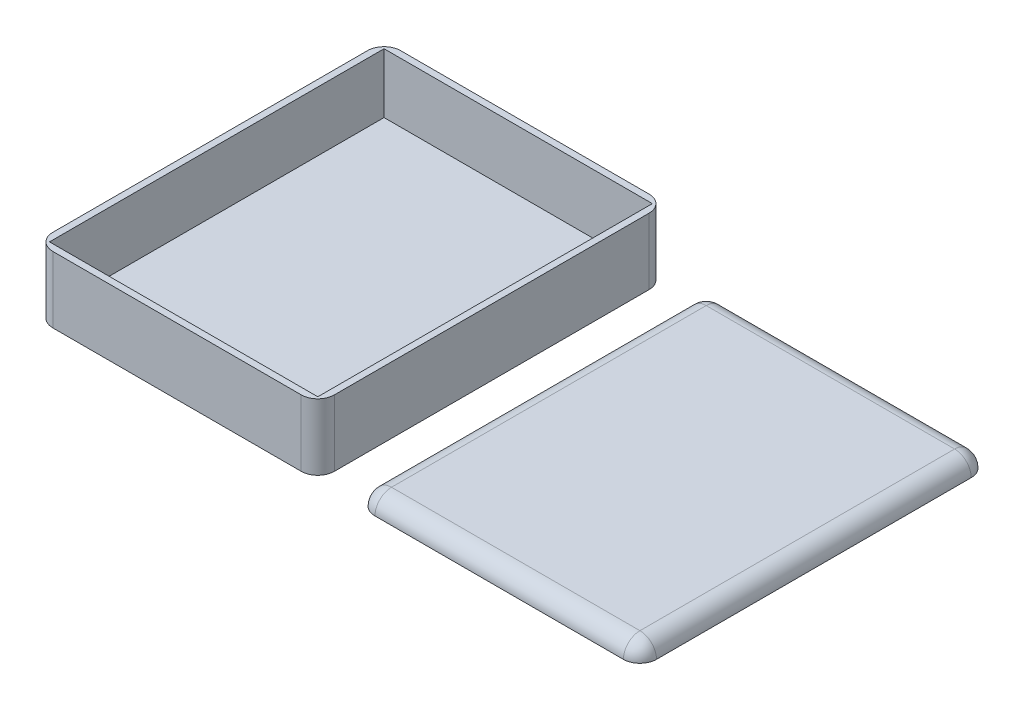
ISO-10303-21;
HEADER;
FILE_DESCRIPTION(('STEP AP214'),'2;1');
FILE_NAME('part.step','',(''),(''),'','','');
FILE_SCHEMA(('AUTOMOTIVE_DESIGN { 1 0 10303 214 1 1 1 1 }'));
ENDSEC;
DATA;
#1=APPLICATION_CONTEXT('core data for automotive mechanical design processes');
#2=APPLICATION_PROTOCOL_DEFINITION('international standard','automotive_design',2000,#1);
#3=PRODUCT_CONTEXT('',#1,'mechanical');
#4=PRODUCT('Part','Part','',(#3));
#5=PRODUCT_RELATED_PRODUCT_CATEGORY('part','',(#4));
#6=PRODUCT_DEFINITION_FORMATION('','',#4);
#7=PRODUCT_DEFINITION_CONTEXT('part definition',#1,'design');
#8=PRODUCT_DEFINITION('design','',#6,#7);
#9=PRODUCT_DEFINITION_SHAPE('','',#8);
#10=(LENGTH_UNIT() NAMED_UNIT(*) SI_UNIT(.MILLI.,.METRE.));
#11=(NAMED_UNIT(*) PLANE_ANGLE_UNIT() SI_UNIT($,.RADIAN.));
#12=(NAMED_UNIT(*) SI_UNIT($,.STERADIAN.) SOLID_ANGLE_UNIT());
#13=UNCERTAINTY_MEASURE_WITH_UNIT(LENGTH_MEASURE(1.E-05),#10,'distance_accuracy_value','');
#14=(GEOMETRIC_REPRESENTATION_CONTEXT(3) GLOBAL_UNCERTAINTY_ASSIGNED_CONTEXT((#13)) GLOBAL_UNIT_ASSIGNED_CONTEXT((#10,
#11,#12)) REPRESENTATION_CONTEXT('',''));
#15=CARTESIAN_POINT('',(0.,0.,0.));
#16=DIRECTION('',(0.,0.,1.));
#17=DIRECTION('',(1.,0.,0.));
#18=AXIS2_PLACEMENT_3D('',#15,#16,#17);
#19=CARTESIAN_POINT('',(0.,5.,0.));
#20=DIRECTION('',(0.,1.,0.));
#21=DIRECTION('',(0.,0.,1.));
#22=AXIS2_PLACEMENT_3D('',#19,#20,#21);
#23=PLANE('',#22);
#24=DIRECTION('',(-1.,0.,0.));
#25=VECTOR('',#24,1.);
#26=CARTESIAN_POINT('',(60.2801641953968,5.,-46.9702641608001));
#27=LINE('',#26,#25);
#28=CARTESIAN_POINT('',(135.280164195397,5.,-46.9702641608001));
#29=VERTEX_POINT('',#28);
#30=CARTESIAN_POINT('',(60.2801641953968,5.,-46.9702641608001));
#31=VERTEX_POINT('',#30);
#32=EDGE_CURVE('E61',#29,#31,#27,.T.);
#33=ORIENTED_EDGE('',*,*,#32,.T.);
#34=DIRECTION('',(0.,0.,1.));
#35=VECTOR('',#34,1.);
#36=CARTESIAN_POINT('',(60.2801641953968,5.,48.0297358391999));
#37=LINE('',#36,#35);
#38=CARTESIAN_POINT('',(60.2801641953968,5.,48.0297358391999));
#39=VERTEX_POINT('',#38);
#40=EDGE_CURVE('E12',#31,#39,#37,.T.);
#41=ORIENTED_EDGE('',*,*,#40,.T.);
#42=DIRECTION('',(1.,0.,0.));
#43=VECTOR('',#42,1.);
#44=CARTESIAN_POINT('',(135.280164195397,5.,48.0297358391999));
#45=LINE('',#44,#43);
#46=CARTESIAN_POINT('',(135.280164195397,5.,48.0297358391999));
#47=VERTEX_POINT('',#46);
#48=EDGE_CURVE('E126',#39,#47,#45,.T.);
#49=ORIENTED_EDGE('',*,*,#48,.T.);
#50=DIRECTION('',(0.,0.,-1.));
#51=VECTOR('',#50,1.);
#52=CARTESIAN_POINT('',(135.280164195397,5.,-46.9702641608001));
#53=LINE('',#52,#51);
#54=EDGE_CURVE('E72',#47,#29,#53,.T.);
#55=ORIENTED_EDGE('',*,*,#54,.T.);
#56=EDGE_LOOP('',(#33,#41,#49,#55));
#57=FACE_BOUND('',#56,.T.);
#58=ADVANCED_FACE('F51',(#57),#23,.T.);
#59=CARTESIAN_POINT('',(0.,0.,0.));
#60=DIRECTION('',(0.,1.,0.));
#61=DIRECTION('',(0.,0.,1.));
#62=AXIS2_PLACEMENT_3D('',#59,#60,#61);
#63=PLANE('',#62);
#64=DIRECTION('',(0.,0.,1.));
#65=VECTOR('',#64,1.);
#66=CARTESIAN_POINT('',(55.2801641953968,0.,-51.9702641608001));
#67=LINE('',#66,#65);
#68=CARTESIAN_POINT('',(55.2801641953968,0.,-46.9702641608001));
#69=VERTEX_POINT('',#68);
#70=CARTESIAN_POINT('',(55.2801641953968,0.,48.0297358391999));
#71=VERTEX_POINT('',#70);
#72=EDGE_CURVE('E105',#69,#71,#67,.T.);
#73=ORIENTED_EDGE('',*,*,#72,.F.);
#74=CARTESIAN_POINT('',(60.2801641953968,0.,-46.9702641608001));
#75=DIRECTION('',(0.,1.,0.));
#76=DIRECTION('',(0.,0.,1.));
#77=AXIS2_PLACEMENT_3D('',#74,#75,#76);
#78=CIRCLE('',#77,5.);
#79=CARTESIAN_POINT('',(60.2801641953968,0.,-51.9702641608001));
#80=VERTEX_POINT('',#79);
#81=EDGE_CURVE('E108',#69,#80,#78,.F.);
#82=ORIENTED_EDGE('',*,*,#81,.T.);
#83=DIRECTION('',(-1.,0.,0.));
#84=VECTOR('',#83,1.);
#85=CARTESIAN_POINT('',(55.2801641953968,0.,-51.9702641608001));
#86=LINE('',#85,#84);
#87=CARTESIAN_POINT('',(135.280164195397,0.,-51.9702641608001));
#88=VERTEX_POINT('',#87);
#89=EDGE_CURVE('E154',#88,#80,#86,.T.);
#90=ORIENTED_EDGE('',*,*,#89,.F.);
#91=CARTESIAN_POINT('',(135.280164195397,0.,-46.9702641608001));
#92=DIRECTION('',(0.,1.,0.));
#93=DIRECTION('',(0.,0.,1.));
#94=AXIS2_PLACEMENT_3D('',#91,#92,#93);
#95=CIRCLE('',#94,5.);
#96=CARTESIAN_POINT('',(140.280164195397,0.,-46.9702641608001));
#97=VERTEX_POINT('',#96);
#98=EDGE_CURVE('E127',#88,#97,#95,.F.);
#99=ORIENTED_EDGE('',*,*,#98,.T.);
#100=DIRECTION('',(0.,0.,-1.));
#101=VECTOR('',#100,1.);
#102=CARTESIAN_POINT('',(140.280164195397,0.,-51.9702641608001));
#103=LINE('',#102,#101);
#104=CARTESIAN_POINT('',(140.280164195397,0.,48.0297358391999));
#105=VERTEX_POINT('',#104);
#106=EDGE_CURVE('E272',#105,#97,#103,.T.);
#107=ORIENTED_EDGE('',*,*,#106,.F.);
#108=CARTESIAN_POINT('',(135.280164195397,0.,48.0297358391999));
#109=DIRECTION('',(0.,1.,0.));
#110=DIRECTION('',(0.,0.,1.));
#111=AXIS2_PLACEMENT_3D('',#108,#109,#110);
#112=CIRCLE('',#111,5.);
#113=CARTESIAN_POINT('',(135.280164195397,0.,53.0297358391999));
#114=VERTEX_POINT('',#113);
#115=EDGE_CURVE('E158',#105,#114,#112,.F.);
#116=ORIENTED_EDGE('',*,*,#115,.T.);
#117=DIRECTION('',(1.,0.,0.));
#118=VECTOR('',#117,1.);
#119=CARTESIAN_POINT('',(55.2801641953968,0.,53.0297358391999));
#120=LINE('',#119,#118);
#121=CARTESIAN_POINT('',(60.2801641953968,0.,53.0297358391999));
#122=VERTEX_POINT('',#121);
#123=EDGE_CURVE('E116',#122,#114,#120,.T.);
#124=ORIENTED_EDGE('',*,*,#123,.F.);
#125=CARTESIAN_POINT('',(60.2801641953968,0.,48.0297358391999));
#126=DIRECTION('',(0.,1.,0.));
#127=DIRECTION('',(0.,0.,1.));
#128=AXIS2_PLACEMENT_3D('',#125,#126,#127);
#129=CIRCLE('',#128,5.);
#130=EDGE_CURVE('E111',#122,#71,#129,.F.);
#131=ORIENTED_EDGE('',*,*,#130,.T.);
#132=EDGE_LOOP('',(#73,#82,#90,#99,#107,#116,#124,#131));
#133=FACE_BOUND('',#132,.T.);
#134=ADVANCED_FACE('F107',(#133),#63,.F.);
#135=CARTESIAN_POINT('',(135.280164195397,0.,-46.9702641608001));
#136=DIRECTION('',(0.,1.,0.));
#137=DIRECTION('',(0.,0.,1.));
#138=AXIS2_PLACEMENT_3D('',#135,#136,#137);
#139=SPHERICAL_SURFACE('',#138,5.);
#140=CARTESIAN_POINT('',(135.280164195397,0.,-46.9702641608001));
#141=DIRECTION('',(0.,0.,1.));
#142=DIRECTION('',(1.,0.,0.));
#143=AXIS2_PLACEMENT_3D('',#140,#141,#142);
#144=CIRCLE('',#143,5.);
#145=EDGE_CURVE('E144',#97,#29,#144,.T.);
#146=ORIENTED_EDGE('',*,*,#145,.F.);
#147=ORIENTED_EDGE('',*,*,#98,.F.);
#148=CARTESIAN_POINT('',(135.280164195397,0.,-46.9702641608001));
#149=DIRECTION('',(-1.,0.,0.));
#150=DIRECTION('',(0.,0.,1.));
#151=AXIS2_PLACEMENT_3D('',#148,#149,#150);
#152=CIRCLE('',#151,5.);
#153=EDGE_CURVE('E55',#29,#88,#152,.T.);
#154=ORIENTED_EDGE('',*,*,#153,.F.);
#155=EDGE_LOOP('',(#146,#147,#154));
#156=FACE_BOUND('',#155,.T.);
#157=ADVANCED_FACE('F53',(#156),#139,.T.);
#158=CARTESIAN_POINT('',(0.,0.,-46.9702641608001));
#159=DIRECTION('',(1.,0.,0.));
#160=DIRECTION('',(0.,0.,-1.));
#161=AXIS2_PLACEMENT_3D('',#158,#159,#160);
#162=CYLINDRICAL_SURFACE('',#161,5.);
#163=ORIENTED_EDGE('',*,*,#153,.T.);
#164=ORIENTED_EDGE('',*,*,#89,.T.);
#165=CARTESIAN_POINT('',(60.2801641953968,0.,-46.9702641608001));
#166=DIRECTION('',(-1.,0.,0.));
#167=DIRECTION('',(0.,0.,1.));
#168=AXIS2_PLACEMENT_3D('',#165,#166,#167);
#169=CIRCLE('',#168,5.);
#170=EDGE_CURVE('E124',#31,#80,#169,.T.);
#171=ORIENTED_EDGE('',*,*,#170,.F.);
#172=ORIENTED_EDGE('',*,*,#32,.F.);
#173=EDGE_LOOP('',(#163,#164,#171,#172));
#174=FACE_BOUND('',#173,.T.);
#175=ADVANCED_FACE('F153',(#174),#162,.T.);
#176=CARTESIAN_POINT('',(135.280164195397,0.,0.));
#177=DIRECTION('',(0.,0.,1.));
#178=DIRECTION('',(1.,0.,0.));
#179=AXIS2_PLACEMENT_3D('',#176,#177,#178);
#180=CYLINDRICAL_SURFACE('',#179,5.);
#181=ORIENTED_EDGE('',*,*,#145,.T.);
#182=ORIENTED_EDGE('',*,*,#54,.F.);
#183=CARTESIAN_POINT('',(135.280164195397,0.,48.0297358391999));
#184=DIRECTION('',(0.,0.,1.));
#185=DIRECTION('',(1.,0.,0.));
#186=AXIS2_PLACEMENT_3D('',#183,#184,#185);
#187=CIRCLE('',#186,5.);
#188=EDGE_CURVE('E131',#105,#47,#187,.T.);
#189=ORIENTED_EDGE('',*,*,#188,.F.);
#190=ORIENTED_EDGE('',*,*,#106,.T.);
#191=EDGE_LOOP('',(#181,#182,#189,#190));
#192=FACE_BOUND('',#191,.T.);
#193=ADVANCED_FACE('F200',(#192),#180,.T.);
#194=CARTESIAN_POINT('',(60.2801641953968,0.,-46.9702641608001));
#195=DIRECTION('',(0.,1.,0.));
#196=DIRECTION('',(0.,0.,1.));
#197=AXIS2_PLACEMENT_3D('',#194,#195,#196);
#198=SPHERICAL_SURFACE('',#197,5.);
#199=ORIENTED_EDGE('',*,*,#170,.T.);
#200=ORIENTED_EDGE('',*,*,#81,.F.);
#201=CARTESIAN_POINT('',(60.2801641953968,0.,-46.9702641608001));
#202=DIRECTION('',(0.,0.,1.));
#203=DIRECTION('',(1.,0.,0.));
#204=AXIS2_PLACEMENT_3D('',#201,#202,#203);
#205=CIRCLE('',#204,5.);
#206=EDGE_CURVE('E122',#31,#69,#205,.T.);
#207=ORIENTED_EDGE('',*,*,#206,.F.);
#208=EDGE_LOOP('',(#199,#200,#207));
#209=FACE_BOUND('',#208,.T.);
#210=ADVANCED_FACE('F121',(#209),#198,.T.);
#211=CARTESIAN_POINT('',(135.280164195397,0.,48.0297358391999));
#212=DIRECTION('',(0.,1.,0.));
#213=DIRECTION('',(0.,0.,1.));
#214=AXIS2_PLACEMENT_3D('',#211,#212,#213);
#215=SPHERICAL_SURFACE('',#214,5.);
#216=ORIENTED_EDGE('',*,*,#115,.F.);
#217=ORIENTED_EDGE('',*,*,#188,.T.);
#218=CARTESIAN_POINT('',(135.280164195397,0.,48.0297358391999));
#219=DIRECTION('',(-1.,0.,0.));
#220=DIRECTION('',(0.,0.,1.));
#221=AXIS2_PLACEMENT_3D('',#218,#219,#220);
#222=CIRCLE('',#221,5.);
#223=EDGE_CURVE('E132',#114,#47,#222,.T.);
#224=ORIENTED_EDGE('',*,*,#223,.F.);
#225=EDGE_LOOP('',(#216,#217,#224));
#226=FACE_BOUND('',#225,.T.);
#227=ADVANCED_FACE('F194',(#226),#215,.T.);
#228=CARTESIAN_POINT('',(60.2801641953968,0.,0.));
#229=DIRECTION('',(0.,0.,-1.));
#230=DIRECTION('',(-1.,0.,0.));
#231=AXIS2_PLACEMENT_3D('',#228,#229,#230);
#232=CYLINDRICAL_SURFACE('',#231,5.);
#233=ORIENTED_EDGE('',*,*,#206,.T.);
#234=ORIENTED_EDGE('',*,*,#72,.T.);
#235=CARTESIAN_POINT('',(60.2801641953968,0.,48.0297358391999));
#236=DIRECTION('',(0.,0.,1.));
#237=DIRECTION('',(1.,0.,0.));
#238=AXIS2_PLACEMENT_3D('',#235,#236,#237);
#239=CIRCLE('',#238,5.);
#240=EDGE_CURVE('E139',#39,#71,#239,.T.);
#241=ORIENTED_EDGE('',*,*,#240,.F.);
#242=ORIENTED_EDGE('',*,*,#40,.F.);
#243=EDGE_LOOP('',(#233,#234,#241,#242));
#244=FACE_BOUND('',#243,.T.);
#245=ADVANCED_FACE('F129',(#244),#232,.T.);
#246=CARTESIAN_POINT('',(0.,0.,48.0297358391999));
#247=DIRECTION('',(-1.,0.,0.));
#248=DIRECTION('',(0.,0.,1.));
#249=AXIS2_PLACEMENT_3D('',#246,#247,#248);
#250=CYLINDRICAL_SURFACE('',#249,5.);
#251=ORIENTED_EDGE('',*,*,#223,.T.);
#252=ORIENTED_EDGE('',*,*,#48,.F.);
#253=CARTESIAN_POINT('',(60.2801641953968,0.,48.0297358391999));
#254=DIRECTION('',(-1.,0.,0.));
#255=DIRECTION('',(0.,0.,1.));
#256=AXIS2_PLACEMENT_3D('',#253,#254,#255);
#257=CIRCLE('',#256,5.);
#258=EDGE_CURVE('E170',#122,#39,#257,.T.);
#259=ORIENTED_EDGE('',*,*,#258,.F.);
#260=ORIENTED_EDGE('',*,*,#123,.T.);
#261=EDGE_LOOP('',(#251,#252,#259,#260));
#262=FACE_BOUND('',#261,.T.);
#263=ADVANCED_FACE('F178',(#262),#250,.T.);
#264=CARTESIAN_POINT('',(60.2801641953968,0.,48.0297358391999));
#265=DIRECTION('',(0.,1.,0.));
#266=DIRECTION('',(0.,0.,1.));
#267=AXIS2_PLACEMENT_3D('',#264,#265,#266);
#268=SPHERICAL_SURFACE('',#267,5.);
#269=ORIENTED_EDGE('',*,*,#240,.T.);
#270=ORIENTED_EDGE('',*,*,#130,.F.);
#271=ORIENTED_EDGE('',*,*,#258,.T.);
#272=EDGE_LOOP('',(#269,#270,#271));
#273=FACE_BOUND('',#272,.T.);
#274=ADVANCED_FACE('F174',(#273),#268,.T.);
#275=CLOSED_SHELL('',(#58,#134,#157,#175,#193,#210,#227,#245,#263,#274));
#276=MANIFOLD_SOLID_BREP('B2',#275);
#277=CARTESIAN_POINT('',(0.,20.,0.));
#278=DIRECTION('',(0.,-1.,0.));
#279=DIRECTION('',(0.,0.,-1.));
#280=AXIS2_PLACEMENT_3D('',#277,#278,#279);
#281=PLANE('',#280);
#282=DIRECTION('',(-1.,0.,0.));
#283=VECTOR('',#282,1.);
#284=CARTESIAN_POINT('',(-42.5,20.,-52.5));
#285=LINE('',#284,#283);
#286=CARTESIAN_POINT('',(37.5,20.,-52.5));
#287=VERTEX_POINT('',#286);
#288=CARTESIAN_POINT('',(-37.5,20.,-52.5));
#289=VERTEX_POINT('',#288);
#290=EDGE_CURVE('E412',#287,#289,#285,.T.);
#291=ORIENTED_EDGE('',*,*,#290,.T.);
#292=CARTESIAN_POINT('',(-37.5,20.,-47.5));
#293=DIRECTION('',(0.,-1.,0.));
#294=DIRECTION('',(0.,0.,-1.));
#295=AXIS2_PLACEMENT_3D('',#292,#293,#294);
#296=CIRCLE('',#295,5.);
#297=CARTESIAN_POINT('',(-42.5,20.,-47.5));
#298=VERTEX_POINT('',#297);
#299=EDGE_CURVE('E453',#289,#298,#296,.F.);
#300=ORIENTED_EDGE('',*,*,#299,.T.);
#301=DIRECTION('',(0.,0.,1.));
#302=VECTOR('',#301,1.);
#303=CARTESIAN_POINT('',(-42.5,20.,52.5));
#304=LINE('',#303,#302);
#305=CARTESIAN_POINT('',(-42.5,20.,47.5));
#306=VERTEX_POINT('',#305);
#307=EDGE_CURVE('E416',#298,#306,#304,.T.);
#308=ORIENTED_EDGE('',*,*,#307,.T.);
#309=CARTESIAN_POINT('',(-37.5,20.,47.5));
#310=DIRECTION('',(0.,-1.,0.));
#311=DIRECTION('',(0.,0.,-1.));
#312=AXIS2_PLACEMENT_3D('',#309,#310,#311);
#313=CIRCLE('',#312,5.);
#314=CARTESIAN_POINT('',(-37.5,20.,52.5));
#315=VERTEX_POINT('',#314);
#316=EDGE_CURVE('E303',#306,#315,#313,.F.);
#317=ORIENTED_EDGE('',*,*,#316,.T.);
#318=DIRECTION('',(1.,0.,0.));
#319=VECTOR('',#318,1.);
#320=CARTESIAN_POINT('',(-42.5,20.,52.5));
#321=LINE('',#320,#319);
#322=CARTESIAN_POINT('',(37.5,20.,52.5));
#323=VERTEX_POINT('',#322);
#324=EDGE_CURVE('E418',#315,#323,#321,.T.);
#325=ORIENTED_EDGE('',*,*,#324,.T.);
#326=CARTESIAN_POINT('',(37.5,20.,47.5));
#327=DIRECTION('',(0.,-1.,0.));
#328=DIRECTION('',(0.,0.,-1.));
#329=AXIS2_PLACEMENT_3D('',#326,#327,#328);
#330=CIRCLE('',#329,5.);
#331=CARTESIAN_POINT('',(42.5,20.,47.5));
#332=VERTEX_POINT('',#331);
#333=EDGE_CURVE('E449',#323,#332,#330,.F.);
#334=ORIENTED_EDGE('',*,*,#333,.T.);
#335=DIRECTION('',(0.,0.,-1.));
#336=VECTOR('',#335,1.);
#337=CARTESIAN_POINT('',(42.5,20.,52.5));
#338=LINE('',#337,#336);
#339=CARTESIAN_POINT('',(42.5,20.,-47.5));
#340=VERTEX_POINT('',#339);
#341=EDGE_CURVE('E409',#332,#340,#338,.T.);
#342=ORIENTED_EDGE('',*,*,#341,.T.);
#343=CARTESIAN_POINT('',(37.5,20.,-47.5));
#344=DIRECTION('',(0.,-1.,0.));
#345=DIRECTION('',(0.,0.,-1.));
#346=AXIS2_PLACEMENT_3D('',#343,#344,#345);
#347=CIRCLE('',#346,5.);
#348=EDGE_CURVE('E451',#340,#287,#347,.F.);
#349=ORIENTED_EDGE('',*,*,#348,.T.);
#350=EDGE_LOOP('',(#291,#300,#308,#317,#325,#334,#342,#349));
#351=FACE_BOUND('',#350,.T.);
#352=DIRECTION('',(0.,0.,-1.));
#353=VECTOR('',#352,1.);
#354=CARTESIAN_POINT('',(40.5,20.,0.));
#355=LINE('',#354,#353);
#356=CARTESIAN_POINT('',(40.5,20.,50.5));
#357=VERTEX_POINT('',#356);
#358=CARTESIAN_POINT('',(40.5,20.,-50.5));
#359=VERTEX_POINT('',#358);
#360=EDGE_CURVE('E398',#357,#359,#355,.T.);
#361=ORIENTED_EDGE('',*,*,#360,.F.);
#362=DIRECTION('',(1.,0.,0.));
#363=VECTOR('',#362,1.);
#364=CARTESIAN_POINT('',(0.,20.,50.5));
#365=LINE('',#364,#363);
#366=CARTESIAN_POINT('',(-40.5,20.,50.5));
#367=VERTEX_POINT('',#366);
#368=EDGE_CURVE('E407',#367,#357,#365,.T.);
#369=ORIENTED_EDGE('',*,*,#368,.F.);
#370=DIRECTION('',(0.,0.,1.));
#371=VECTOR('',#370,1.);
#372=CARTESIAN_POINT('',(-40.5,20.,0.));
#373=LINE('',#372,#371);
#374=CARTESIAN_POINT('',(-40.5,20.,-50.5));
#375=VERTEX_POINT('',#374);
#376=EDGE_CURVE('E405',#375,#367,#373,.T.);
#377=ORIENTED_EDGE('',*,*,#376,.F.);
#378=DIRECTION('',(-1.,0.,0.));
#379=VECTOR('',#378,1.);
#380=CARTESIAN_POINT('',(0.,20.,-50.5));
#381=LINE('',#380,#379);
#382=EDGE_CURVE('E387',#359,#375,#381,.T.);
#383=ORIENTED_EDGE('',*,*,#382,.F.);
#384=EDGE_LOOP('',(#361,#369,#377,#383));
#385=FACE_BOUND('',#384,.T.);
#386=ADVANCED_FACE('F283',(#351,#385),#281,.F.);
#387=CARTESIAN_POINT('',(42.5,20.,52.5));
#388=DIRECTION('',(-1.,0.,0.));
#389=DIRECTION('',(0.,0.,1.));
#390=AXIS2_PLACEMENT_3D('',#387,#388,#389);
#391=PLANE('',#390);
#392=DIRECTION('',(0.,0.,-1.));
#393=VECTOR('',#392,1.);
#394=CARTESIAN_POINT('',(42.5,0.,52.5));
#395=LINE('',#394,#393);
#396=CARTESIAN_POINT('',(42.5,0.,47.5));
#397=VERTEX_POINT('',#396);
#398=CARTESIAN_POINT('',(42.5,0.,-47.5));
#399=VERTEX_POINT('',#398);
#400=EDGE_CURVE('E421',#397,#399,#395,.T.);
#401=ORIENTED_EDGE('',*,*,#400,.T.);
#402=DIRECTION('',(0.,-1.,0.));
#403=VECTOR('',#402,1.);
#404=CARTESIAN_POINT('',(42.5,20.,-47.5));
#405=LINE('',#404,#403);
#406=EDGE_CURVE('E458',#399,#340,#405,.F.);
#407=ORIENTED_EDGE('',*,*,#406,.T.);
#408=ORIENTED_EDGE('',*,*,#341,.F.);
#409=DIRECTION('',(0.,-1.,0.));
#410=VECTOR('',#409,1.);
#411=CARTESIAN_POINT('',(42.5,20.,47.5));
#412=LINE('',#411,#410);
#413=EDGE_CURVE('E455',#332,#397,#412,.T.);
#414=ORIENTED_EDGE('',*,*,#413,.T.);
#415=EDGE_LOOP('',(#401,#407,#408,#414));
#416=FACE_BOUND('',#415,.T.);
#417=ADVANCED_FACE('F474',(#416),#391,.F.);
#418=CARTESIAN_POINT('',(-42.5,20.,-52.5));
#419=DIRECTION('',(0.,0.,1.));
#420=DIRECTION('',(1.,0.,0.));
#421=AXIS2_PLACEMENT_3D('',#418,#419,#420);
#422=PLANE('',#421);
#423=DIRECTION('',(-1.,0.,0.));
#424=VECTOR('',#423,1.);
#425=CARTESIAN_POINT('',(-42.5,0.,-52.5));
#426=LINE('',#425,#424);
#427=CARTESIAN_POINT('',(37.5,0.,-52.5));
#428=VERTEX_POINT('',#427);
#429=CARTESIAN_POINT('',(-37.5,0.,-52.5));
#430=VERTEX_POINT('',#429);
#431=EDGE_CURVE('E424',#428,#430,#426,.T.);
#432=ORIENTED_EDGE('',*,*,#431,.T.);
#433=DIRECTION('',(0.,-1.,0.));
#434=VECTOR('',#433,1.);
#435=CARTESIAN_POINT('',(-37.5,20.,-52.5));
#436=LINE('',#435,#434);
#437=EDGE_CURVE('E446',#430,#289,#436,.F.);
#438=ORIENTED_EDGE('',*,*,#437,.T.);
#439=ORIENTED_EDGE('',*,*,#290,.F.);
#440=DIRECTION('',(0.,-1.,0.));
#441=VECTOR('',#440,1.);
#442=CARTESIAN_POINT('',(37.5,20.,-52.5));
#443=LINE('',#442,#441);
#444=EDGE_CURVE('E443',#287,#428,#443,.T.);
#445=ORIENTED_EDGE('',*,*,#444,.T.);
#446=EDGE_LOOP('',(#432,#438,#439,#445));
#447=FACE_BOUND('',#446,.T.);
#448=ADVANCED_FACE('F484',(#447),#422,.F.);
#449=CARTESIAN_POINT('',(-42.5,20.,52.5));
#450=DIRECTION('',(1.,0.,0.));
#451=DIRECTION('',(0.,0.,-1.));
#452=AXIS2_PLACEMENT_3D('',#449,#450,#451);
#453=PLANE('',#452);
#454=ORIENTED_EDGE('',*,*,#307,.F.);
#455=DIRECTION('',(0.,-1.,0.));
#456=VECTOR('',#455,1.);
#457=CARTESIAN_POINT('',(-42.5,20.,-47.5));
#458=LINE('',#457,#456);
#459=CARTESIAN_POINT('',(-42.5,0.,-47.5));
#460=VERTEX_POINT('',#459);
#461=EDGE_CURVE('E432',#298,#460,#458,.T.);
#462=ORIENTED_EDGE('',*,*,#461,.T.);
#463=DIRECTION('',(0.,0.,1.));
#464=VECTOR('',#463,1.);
#465=CARTESIAN_POINT('',(-42.5,0.,52.5));
#466=LINE('',#465,#464);
#467=CARTESIAN_POINT('',(-42.5,0.,47.5));
#468=VERTEX_POINT('',#467);
#469=EDGE_CURVE('E427',#460,#468,#466,.T.);
#470=ORIENTED_EDGE('',*,*,#469,.T.);
#471=DIRECTION('',(0.,-1.,0.));
#472=VECTOR('',#471,1.);
#473=CARTESIAN_POINT('',(-42.5,20.,47.5));
#474=LINE('',#473,#472);
#475=EDGE_CURVE('E420',#468,#306,#474,.F.);
#476=ORIENTED_EDGE('',*,*,#475,.T.);
#477=EDGE_LOOP('',(#454,#462,#470,#476));
#478=FACE_BOUND('',#477,.T.);
#479=ADVANCED_FACE('F492',(#478),#453,.F.);
#480=CARTESIAN_POINT('',(-42.5,20.,52.5));
#481=DIRECTION('',(0.,0.,-1.));
#482=DIRECTION('',(-1.,0.,0.));
#483=AXIS2_PLACEMENT_3D('',#480,#481,#482);
#484=PLANE('',#483);
#485=DIRECTION('',(1.,0.,0.));
#486=VECTOR('',#485,1.);
#487=CARTESIAN_POINT('',(-42.5,0.,52.5));
#488=LINE('',#487,#486);
#489=CARTESIAN_POINT('',(-37.5,0.,52.5));
#490=VERTEX_POINT('',#489);
#491=CARTESIAN_POINT('',(37.5,0.,52.5));
#492=VERTEX_POINT('',#491);
#493=EDGE_CURVE('E413',#490,#492,#488,.T.);
#494=ORIENTED_EDGE('',*,*,#493,.T.);
#495=DIRECTION('',(0.,-1.,0.));
#496=VECTOR('',#495,1.);
#497=CARTESIAN_POINT('',(37.5,20.,52.5));
#498=LINE('',#497,#496);
#499=EDGE_CURVE('E49',#492,#323,#498,.F.);
#500=ORIENTED_EDGE('',*,*,#499,.T.);
#501=ORIENTED_EDGE('',*,*,#324,.F.);
#502=DIRECTION('',(0.,-1.,0.));
#503=VECTOR('',#502,1.);
#504=CARTESIAN_POINT('',(-37.5,20.,52.5));
#505=LINE('',#504,#503);
#506=EDGE_CURVE('E291',#315,#490,#505,.T.);
#507=ORIENTED_EDGE('',*,*,#506,.T.);
#508=EDGE_LOOP('',(#494,#500,#501,#507));
#509=FACE_BOUND('',#508,.T.);
#510=ADVANCED_FACE('F462',(#509),#484,.F.);
#511=CARTESIAN_POINT('',(0.,0.,0.));
#512=DIRECTION('',(0.,-1.,0.));
#513=DIRECTION('',(0.,0.,-1.));
#514=AXIS2_PLACEMENT_3D('',#511,#512,#513);
#515=PLANE('',#514);
#516=ORIENTED_EDGE('',*,*,#469,.F.);
#517=CARTESIAN_POINT('',(-37.5,0.,-47.5));
#518=DIRECTION('',(0.,-1.,0.));
#519=DIRECTION('',(0.,0.,-1.));
#520=AXIS2_PLACEMENT_3D('',#517,#518,#519);
#521=CIRCLE('',#520,5.);
#522=EDGE_CURVE('E441',#460,#430,#521,.T.);
#523=ORIENTED_EDGE('',*,*,#522,.T.);
#524=ORIENTED_EDGE('',*,*,#431,.F.);
#525=CARTESIAN_POINT('',(37.5,0.,-47.5));
#526=DIRECTION('',(0.,-1.,0.));
#527=DIRECTION('',(0.,0.,-1.));
#528=AXIS2_PLACEMENT_3D('',#525,#526,#527);
#529=CIRCLE('',#528,5.);
#530=EDGE_CURVE('E439',#428,#399,#529,.T.);
#531=ORIENTED_EDGE('',*,*,#530,.T.);
#532=ORIENTED_EDGE('',*,*,#400,.F.);
#533=CARTESIAN_POINT('',(37.5,0.,47.5));
#534=DIRECTION('',(0.,-1.,0.));
#535=DIRECTION('',(0.,0.,-1.));
#536=AXIS2_PLACEMENT_3D('',#533,#534,#535);
#537=CIRCLE('',#536,5.);
#538=EDGE_CURVE('E437',#397,#492,#537,.T.);
#539=ORIENTED_EDGE('',*,*,#538,.T.);
#540=ORIENTED_EDGE('',*,*,#493,.F.);
#541=CARTESIAN_POINT('',(-37.5,0.,47.5));
#542=DIRECTION('',(0.,-1.,0.));
#543=DIRECTION('',(0.,0.,-1.));
#544=AXIS2_PLACEMENT_3D('',#541,#542,#543);
#545=CIRCLE('',#544,5.);
#546=EDGE_CURVE('E435',#490,#468,#545,.T.);
#547=ORIENTED_EDGE('',*,*,#546,.T.);
#548=EDGE_LOOP('',(#516,#523,#524,#531,#532,#539,#540,#547));
#549=FACE_BOUND('',#548,.T.);
#550=ADVANCED_FACE('F466',(#549),#515,.T.);
#551=CARTESIAN_POINT('',(40.5,20.,52.5));
#552=DIRECTION('',(-1.,0.,0.));
#553=DIRECTION('',(0.,0.,1.));
#554=AXIS2_PLACEMENT_3D('',#551,#552,#553);
#555=PLANE('',#554);
#556=DIRECTION('',(0.,0.,-1.));
#557=VECTOR('',#556,1.);
#558=CARTESIAN_POINT('',(40.5,2.,0.));
#559=LINE('',#558,#557);
#560=CARTESIAN_POINT('',(40.5,2.,50.5));
#561=VERTEX_POINT('',#560);
#562=CARTESIAN_POINT('',(40.5,2.,-50.5));
#563=VERTEX_POINT('',#562);
#564=EDGE_CURVE('E378',#561,#563,#559,.T.);
#565=ORIENTED_EDGE('',*,*,#564,.F.);
#566=DIRECTION('',(0.,-1.,0.));
#567=VECTOR('',#566,1.);
#568=CARTESIAN_POINT('',(40.5,20.,50.5));
#569=LINE('',#568,#567);
#570=EDGE_CURVE('E401',#357,#561,#569,.T.);
#571=ORIENTED_EDGE('',*,*,#570,.F.);
#572=ORIENTED_EDGE('',*,*,#360,.T.);
#573=DIRECTION('',(0.,-1.,0.));
#574=VECTOR('',#573,1.);
#575=CARTESIAN_POINT('',(40.5,20.,-50.5));
#576=LINE('',#575,#574);
#577=EDGE_CURVE('E391',#359,#563,#576,.T.);
#578=ORIENTED_EDGE('',*,*,#577,.T.);
#579=EDGE_LOOP('',(#565,#571,#572,#578));
#580=FACE_BOUND('',#579,.T.);
#581=ADVANCED_FACE('F509',(#580),#555,.T.);
#582=CARTESIAN_POINT('',(-42.5,20.,-50.5));
#583=DIRECTION('',(0.,0.,1.));
#584=DIRECTION('',(1.,0.,0.));
#585=AXIS2_PLACEMENT_3D('',#582,#583,#584);
#586=PLANE('',#585);
#587=DIRECTION('',(-1.,0.,0.));
#588=VECTOR('',#587,1.);
#589=CARTESIAN_POINT('',(0.,2.,-50.5));
#590=LINE('',#589,#588);
#591=CARTESIAN_POINT('',(-40.5,2.,-50.5));
#592=VERTEX_POINT('',#591);
#593=EDGE_CURVE('E371',#563,#592,#590,.T.);
#594=ORIENTED_EDGE('',*,*,#593,.F.);
#595=ORIENTED_EDGE('',*,*,#577,.F.);
#596=ORIENTED_EDGE('',*,*,#382,.T.);
#597=DIRECTION('',(0.,-1.,0.));
#598=VECTOR('',#597,1.);
#599=CARTESIAN_POINT('',(-40.5,20.,-50.5));
#600=LINE('',#599,#598);
#601=EDGE_CURVE('E384',#375,#592,#600,.T.);
#602=ORIENTED_EDGE('',*,*,#601,.T.);
#603=EDGE_LOOP('',(#594,#595,#596,#602));
#604=FACE_BOUND('',#603,.T.);
#605=ADVANCED_FACE('F385',(#604),#586,.T.);
#606=CARTESIAN_POINT('',(-40.5,20.,52.5));
#607=DIRECTION('',(1.,0.,0.));
#608=DIRECTION('',(0.,0.,-1.));
#609=AXIS2_PLACEMENT_3D('',#606,#607,#608);
#610=PLANE('',#609);
#611=DIRECTION('',(0.,0.,1.));
#612=VECTOR('',#611,1.);
#613=CARTESIAN_POINT('',(-40.5,2.,0.));
#614=LINE('',#613,#612);
#615=CARTESIAN_POINT('',(-40.5,2.,50.5));
#616=VERTEX_POINT('',#615);
#617=EDGE_CURVE('E375',#592,#616,#614,.T.);
#618=ORIENTED_EDGE('',*,*,#617,.F.);
#619=ORIENTED_EDGE('',*,*,#601,.F.);
#620=ORIENTED_EDGE('',*,*,#376,.T.);
#621=DIRECTION('',(0.,-1.,0.));
#622=VECTOR('',#621,1.);
#623=CARTESIAN_POINT('',(-40.5,20.,50.5));
#624=LINE('',#623,#622);
#625=EDGE_CURVE('E392',#367,#616,#624,.T.);
#626=ORIENTED_EDGE('',*,*,#625,.T.);
#627=EDGE_LOOP('',(#618,#619,#620,#626));
#628=FACE_BOUND('',#627,.T.);
#629=ADVANCED_FACE('F394',(#628),#610,.T.);
#630=CARTESIAN_POINT('',(-42.5,20.,50.5));
#631=DIRECTION('',(0.,0.,-1.));
#632=DIRECTION('',(-1.,0.,0.));
#633=AXIS2_PLACEMENT_3D('',#630,#631,#632);
#634=PLANE('',#633);
#635=DIRECTION('',(1.,0.,0.));
#636=VECTOR('',#635,1.);
#637=CARTESIAN_POINT('',(0.,2.,50.5));
#638=LINE('',#637,#636);
#639=EDGE_CURVE('E396',#616,#561,#638,.T.);
#640=ORIENTED_EDGE('',*,*,#639,.F.);
#641=ORIENTED_EDGE('',*,*,#625,.F.);
#642=ORIENTED_EDGE('',*,*,#368,.T.);
#643=ORIENTED_EDGE('',*,*,#570,.T.);
#644=EDGE_LOOP('',(#640,#641,#642,#643));
#645=FACE_BOUND('',#644,.T.);
#646=ADVANCED_FACE('F548',(#645),#634,.T.);
#647=CARTESIAN_POINT('',(0.,2.,0.));
#648=DIRECTION('',(0.,-1.,0.));
#649=DIRECTION('',(0.,0.,-1.));
#650=AXIS2_PLACEMENT_3D('',#647,#648,#649);
#651=PLANE('',#650);
#652=ORIENTED_EDGE('',*,*,#564,.T.);
#653=ORIENTED_EDGE('',*,*,#593,.T.);
#654=ORIENTED_EDGE('',*,*,#617,.T.);
#655=ORIENTED_EDGE('',*,*,#639,.T.);
#656=EDGE_LOOP('',(#652,#653,#654,#655));
#657=FACE_BOUND('',#656,.T.);
#658=ADVANCED_FACE('F373',(#657),#651,.F.);
#659=CARTESIAN_POINT('',(-37.5,20.,-47.5));
#660=DIRECTION('',(0.,-1.,0.));
#661=DIRECTION('',(0.,0.,-1.));
#662=AXIS2_PLACEMENT_3D('',#659,#660,#661);
#663=CYLINDRICAL_SURFACE('',#662,5.);
#664=ORIENTED_EDGE('',*,*,#299,.F.);
#665=ORIENTED_EDGE('',*,*,#437,.F.);
#666=ORIENTED_EDGE('',*,*,#522,.F.);
#667=ORIENTED_EDGE('',*,*,#461,.F.);
#668=EDGE_LOOP('',(#664,#665,#666,#667));
#669=FACE_BOUND('',#668,.T.);
#670=ADVANCED_FACE('F489',(#669),#663,.T.);
#671=CARTESIAN_POINT('',(37.5,20.,-47.5));
#672=DIRECTION('',(0.,-1.,0.));
#673=DIRECTION('',(0.,0.,-1.));
#674=AXIS2_PLACEMENT_3D('',#671,#672,#673);
#675=CYLINDRICAL_SURFACE('',#674,5.);
#676=ORIENTED_EDGE('',*,*,#348,.F.);
#677=ORIENTED_EDGE('',*,*,#406,.F.);
#678=ORIENTED_EDGE('',*,*,#530,.F.);
#679=ORIENTED_EDGE('',*,*,#444,.F.);
#680=EDGE_LOOP('',(#676,#677,#678,#679));
#681=FACE_BOUND('',#680,.T.);
#682=ADVANCED_FACE('F481',(#681),#675,.T.);
#683=CARTESIAN_POINT('',(37.5,20.,47.5));
#684=DIRECTION('',(0.,-1.,0.));
#685=DIRECTION('',(0.,0.,-1.));
#686=AXIS2_PLACEMENT_3D('',#683,#684,#685);
#687=CYLINDRICAL_SURFACE('',#686,5.);
#688=ORIENTED_EDGE('',*,*,#333,.F.);
#689=ORIENTED_EDGE('',*,*,#499,.F.);
#690=ORIENTED_EDGE('',*,*,#538,.F.);
#691=ORIENTED_EDGE('',*,*,#413,.F.);
#692=EDGE_LOOP('',(#688,#689,#690,#691));
#693=FACE_BOUND('',#692,.T.);
#694=ADVANCED_FACE('F471',(#693),#687,.T.);
#695=CARTESIAN_POINT('',(-37.5,20.,47.5));
#696=DIRECTION('',(0.,-1.,0.));
#697=DIRECTION('',(0.,0.,-1.));
#698=AXIS2_PLACEMENT_3D('',#695,#696,#697);
#699=CYLINDRICAL_SURFACE('',#698,5.);
#700=ORIENTED_EDGE('',*,*,#316,.F.);
#701=ORIENTED_EDGE('',*,*,#475,.F.);
#702=ORIENTED_EDGE('',*,*,#546,.F.);
#703=ORIENTED_EDGE('',*,*,#506,.F.);
#704=EDGE_LOOP('',(#700,#701,#702,#703));
#705=FACE_BOUND('',#704,.T.);
#706=ADVANCED_FACE('F285',(#705),#699,.T.);
#707=CLOSED_SHELL('',(#386,#417,#448,#479,#510,#550,#581,#605,#629,#646,#658,#670,#682,#694,#706));
#708=MANIFOLD_SOLID_BREP('B6',#707);
#709=ADVANCED_BREP_SHAPE_REPRESENTATION('',(#18,#276,#708),#14);
#710=SHAPE_DEFINITION_REPRESENTATION(#9,#709);
ENDSEC;
END-ISO-10303-21;
